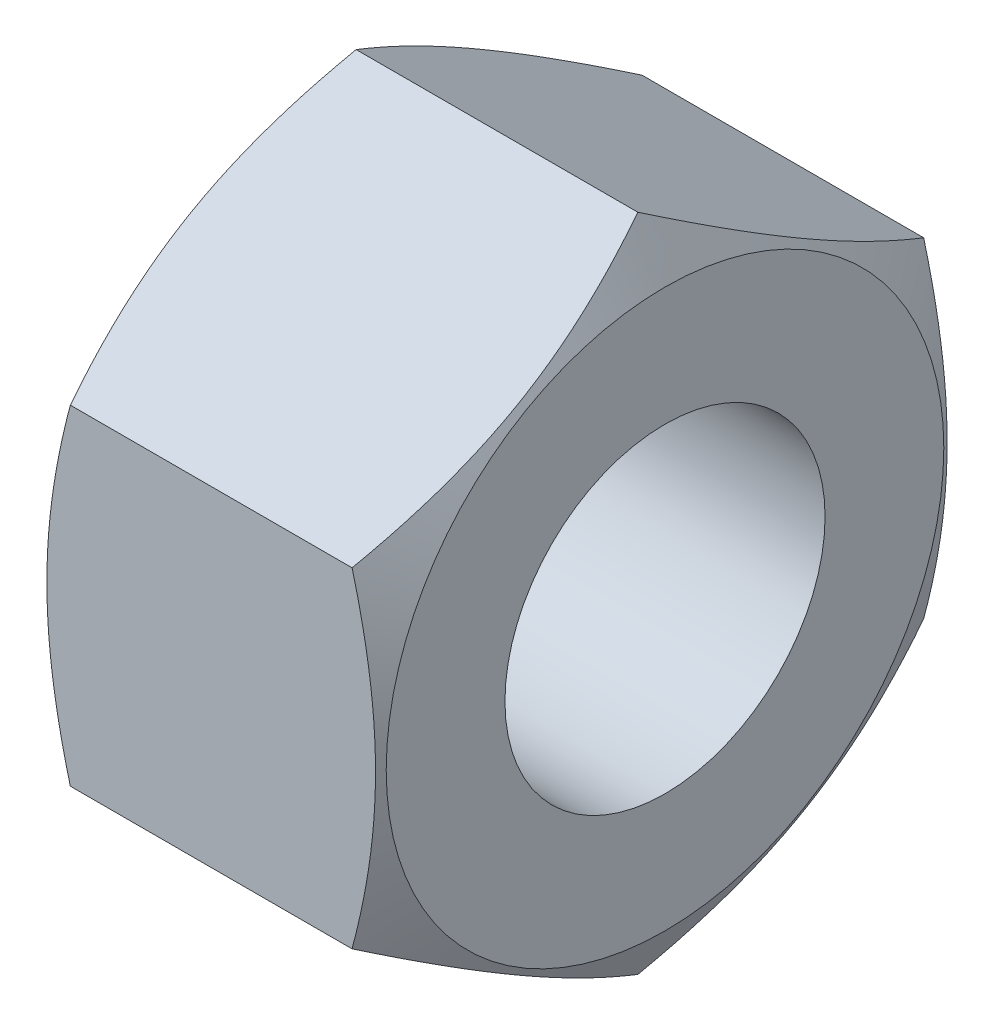
ISO-10303-21;
HEADER;
FILE_DESCRIPTION(('STEP AP214'),'2;1');
FILE_NAME('part.step','',(''),(''),'','','');
FILE_SCHEMA(('AUTOMOTIVE_DESIGN { 1 0 10303 214 1 1 1 1 }'));
ENDSEC;
DATA;
#1=APPLICATION_CONTEXT('core data for automotive mechanical design processes');
#2=APPLICATION_PROTOCOL_DEFINITION('international standard','automotive_design',2000,#1);
#3=PRODUCT_CONTEXT('',#1,'mechanical');
#4=PRODUCT('Part','Part','',(#3));
#5=PRODUCT_RELATED_PRODUCT_CATEGORY('part','',(#4));
#6=PRODUCT_DEFINITION_FORMATION('','',#4);
#7=PRODUCT_DEFINITION_CONTEXT('part definition',#1,'design');
#8=PRODUCT_DEFINITION('design','',#6,#7);
#9=PRODUCT_DEFINITION_SHAPE('','',#8);
#10=(LENGTH_UNIT() NAMED_UNIT(*) SI_UNIT(.MILLI.,.METRE.));
#11=(NAMED_UNIT(*) PLANE_ANGLE_UNIT() SI_UNIT($,.RADIAN.));
#12=(NAMED_UNIT(*) SI_UNIT($,.STERADIAN.) SOLID_ANGLE_UNIT());
#13=UNCERTAINTY_MEASURE_WITH_UNIT(LENGTH_MEASURE(1.E-05),#10,'distance_accuracy_value','');
#14=(GEOMETRIC_REPRESENTATION_CONTEXT(3) GLOBAL_UNCERTAINTY_ASSIGNED_CONTEXT((#13)) GLOBAL_UNIT_ASSIGNED_CONTEXT((#10,
#11,#12)) REPRESENTATION_CONTEXT('',''));
#15=CARTESIAN_POINT('',(0.,0.,0.));
#16=DIRECTION('',(0.,0.,1.));
#17=DIRECTION('',(1.,0.,0.));
#18=AXIS2_PLACEMENT_3D('',#15,#16,#17);
#19=CARTESIAN_POINT('',(4.1656,4.0914504176392,-7.0866));
#20=DIRECTION('',(0.,-0.866025403784439,0.5));
#21=DIRECTION('',(0.,-0.5,-0.866025403784439));
#22=AXIS2_PLACEMENT_3D('',#19,#20,#21);
#23=PLANE('',#22);
#24=DIRECTION('',(-1.,0.,0.));
#25=VECTOR('',#24,1.);
#26=CARTESIAN_POINT('',(4.1656,4.0914504176392,-7.0866));
#27=LINE('',#26,#25);
#28=CARTESIAN_POINT('',(3.49291061007736,4.09145041763921,-7.0866));
#29=VERTEX_POINT('',#28);
#30=CARTESIAN_POINT('',(-3.49291061007737,4.0914504176392,-7.0866));
#31=VERTEX_POINT('',#30);
#32=EDGE_CURVE('E118',#29,#31,#27,.T.);
#33=ORIENTED_EDGE('',*,*,#32,.T.);
#34=CARTESIAN_POINT('',(-3.49284944698746,4.09133494758537,-7.0868));
#35=CARTESIAN_POINT('',(-3.54013592969712,4.1806201534766,-6.93215348703214));
#36=CARTESIAN_POINT('',(-3.58526387533373,4.2701872542963,-6.77701871772578));
#37=CARTESIAN_POINT('',(-3.67063587417591,4.44993286243088,-6.46569019199931));
#38=CARTESIAN_POINT('',(-3.71087823275817,4.54011157050205,-6.30949608785912));
#39=CARTESIAN_POINT('',(-3.82350528792309,4.81184839157855,-5.83883410746738));
#40=CARTESIAN_POINT('',(-3.88762666610634,4.99430645597668,-5.52280746967914));
#41=CARTESIAN_POINT('',(-3.96326890457504,5.26745543006076,-5.0496995685302));
#42=CARTESIAN_POINT('',(-3.98493435723433,5.3574629975987,-4.89380188848879));
#43=CARTESIAN_POINT('',(-4.02142922279015,5.53782338463285,-4.58140853447285));
#44=CARTESIAN_POINT('',(-4.03625913133281,5.62817617861748,-4.42491290468567));
#45=CARTESIAN_POINT('',(-4.05873169011805,5.80902364400902,-4.11167590620747));
#46=CARTESIAN_POINT('',(-4.06638089663388,5.89951811028071,-3.95493489282109));
#47=CARTESIAN_POINT('',(-4.07434155678021,6.08058259164757,-3.64132201164757));
#48=CARTESIAN_POINT('',(-4.07465318235712,6.17115260492267,-3.4844501470129));
#49=CARTESIAN_POINT('',(-4.06528776525616,6.42242679222706,-3.04923048797112));
#50=CARTESIAN_POINT('',(-4.04768026282338,6.58307242484238,-2.77098409026735));
#51=CARTESIAN_POINT('',(-3.99047362355076,6.90347354772477,-2.21603306663293));
#52=CARTESIAN_POINT('',(-3.95085756597656,7.06322825745894,-1.93932979262492));
#53=CARTESIAN_POINT('',(-3.85130371945199,7.38420380751608,-1.38338383193859));
#54=CARTESIAN_POINT('',(-3.79099589862718,7.54539526684749,-1.10419203463041));
#55=CARTESIAN_POINT('',(-3.65364471299299,7.86572449177811,-0.549365541901417));
#56=CARTESIAN_POINT('',(-3.57662881892472,8.02486517947751,-0.273725785254608));
#57=CARTESIAN_POINT('',(-3.49284944698746,8.18301630533225,0.000200000000012393));
#58=B_SPLINE_CURVE_WITH_KNOTS('',3,(#34,#35,#36,#37,#38,#39,#40,#41,#42,#43,#44,#45,#46,#47,#48,
#49,#50,#51,#52,#53,#54,#55,#56,#57),.UNSPECIFIED.,.F.,.F.,(4,2,2,2,2,2,2,2,2,2,2,4),(0.,
0.554138489511831,1.10846864261952,2.21899620872019,2.76283413836877,3.30663262805729,
3.8499341232908,4.39322288696728,5.35766792749024,6.3228554859864,7.30629033999155,
8.28812036143337),.UNSPECIFIED.);
#59=CARTESIAN_POINT('',(-3.49291061007736,8.18290083527841,0.));
#60=VERTEX_POINT('',#59);
#61=EDGE_CURVE('E53',#31,#60,#58,.T.);
#62=ORIENTED_EDGE('',*,*,#61,.T.);
#63=DIRECTION('',(-1.,0.,0.));
#64=VECTOR('',#63,1.);
#65=CARTESIAN_POINT('',(4.1656,8.18290083527841,0.));
#66=LINE('',#65,#64);
#67=CARTESIAN_POINT('',(3.49291061007736,8.18290083527841,0.));
#68=VERTEX_POINT('',#67);
#69=EDGE_CURVE('E11',#68,#60,#66,.T.);
#70=ORIENTED_EDGE('',*,*,#69,.F.);
#71=CARTESIAN_POINT('',(3.49284944698746,8.18301630533225,0.000200000000013293));
#72=CARTESIAN_POINT('',(3.54013592969712,8.09373109944102,-0.154446512967842));
#73=CARTESIAN_POINT('',(3.58526387533373,8.00416399862132,-0.309581282274208));
#74=CARTESIAN_POINT('',(3.67063587417591,7.82441839048673,-0.620909808000674));
#75=CARTESIAN_POINT('',(3.71087823275817,7.73423968241556,-0.777103912140869));
#76=CARTESIAN_POINT('',(3.82350528792309,7.46250286133907,-1.24776589253261));
#77=CARTESIAN_POINT('',(3.88762666610634,7.28004479694093,-1.56379253032085));
#78=CARTESIAN_POINT('',(3.96326890457504,7.00689582285685,-2.03690043146979));
#79=CARTESIAN_POINT('',(3.98493435723432,6.91688825531891,-2.19279811151119));
#80=CARTESIAN_POINT('',(4.02142922279014,6.73652786828476,-2.50519146552713));
#81=CARTESIAN_POINT('',(4.03625913133281,6.64617507430013,-2.66168709531431));
#82=CARTESIAN_POINT('',(4.05873169011804,6.46532760890859,-2.97492409379252));
#83=CARTESIAN_POINT('',(4.06638089663388,6.37483314263691,-3.1316651071789));
#84=CARTESIAN_POINT('',(4.07434155678021,6.19376866127004,-3.44527798835242));
#85=CARTESIAN_POINT('',(4.07465318235712,6.10319864799494,-3.60214985298708));
#86=CARTESIAN_POINT('',(4.06528776525616,5.85192446069055,-4.03736951202887));
#87=CARTESIAN_POINT('',(4.04768026282338,5.69127882807524,-4.31561590973263));
#88=CARTESIAN_POINT('',(3.99047362355076,5.37087770519284,-4.87056693336706));
#89=CARTESIAN_POINT('',(3.95085756597656,5.21112299545867,-5.14727020737506));
#90=CARTESIAN_POINT('',(3.85130371945199,4.89014744540153,-5.7032161680614));
#91=CARTESIAN_POINT('',(3.79099589862718,4.72895598607012,-5.98240796536958));
#92=CARTESIAN_POINT('',(3.65364471299299,4.4086267611395,-6.53723445809857));
#93=CARTESIAN_POINT('',(3.57662881892472,4.2494860734401,-6.81287421474538));
#94=CARTESIAN_POINT('',(3.49284944698746,4.09133494758537,-7.0868));
#95=B_SPLINE_CURVE_WITH_KNOTS('',3,(#71,#72,#73,#74,#75,#76,#77,#78,#79,#80,#81,#82,#83,#84,#85,
#86,#87,#88,#89,#90,#91,#92,#93,#94),.UNSPECIFIED.,.F.,.F.,(4,2,2,2,2,2,2,2,2,2,2,4),(0.,
0.554138489511831,1.10846864261952,2.21899620872019,2.76283413836877,3.3066326280573,
3.8499341232908,4.39322288696728,5.35766792749025,6.3228554859864,7.30629033999155,
8.28812036143337),.UNSPECIFIED.);
#96=EDGE_CURVE('E121',#68,#29,#95,.T.);
#97=ORIENTED_EDGE('',*,*,#96,.T.);
#98=EDGE_LOOP('',(#33,#62,#70,#97));
#99=FACE_BOUND('',#98,.T.);
#100=ADVANCED_FACE('F38',(#99),#23,.F.);
#101=CARTESIAN_POINT('',(4.1656,8.18290083527841,0.));
#102=DIRECTION('',(0.,-0.866025403784438,-0.5));
#103=DIRECTION('',(0.,0.5,-0.866025403784438));
#104=AXIS2_PLACEMENT_3D('',#101,#102,#103);
#105=PLANE('',#104);
#106=ORIENTED_EDGE('',*,*,#69,.T.);
#107=CARTESIAN_POINT('',(-3.49284944698746,8.18301630533225,-0.000199999999986746));
#108=CARTESIAN_POINT('',(-3.54013592969712,8.09373109944102,0.154446512967869));
#109=CARTESIAN_POINT('',(-3.58526387533373,8.00416399862132,0.309581282274235));
#110=CARTESIAN_POINT('',(-3.67063587417591,7.82441839048673,0.6209098080007));
#111=CARTESIAN_POINT('',(-3.71087823275817,7.73423968241556,0.777103912140895));
#112=CARTESIAN_POINT('',(-3.82350528792309,7.46250286133907,1.24776589253263));
#113=CARTESIAN_POINT('',(-3.88762666610634,7.28004479694093,1.56379253032087));
#114=CARTESIAN_POINT('',(-3.96326890457503,7.00689582285685,2.03690043146982));
#115=CARTESIAN_POINT('',(-3.98493435723432,6.91688825531891,2.19279811151122));
#116=CARTESIAN_POINT('',(-4.02142922279014,6.73652786828476,2.50519146552716));
#117=CARTESIAN_POINT('',(-4.03625913133281,6.64617507430013,2.66168709531434));
#118=CARTESIAN_POINT('',(-4.05873169011804,6.46532760890859,2.97492409379254));
#119=CARTESIAN_POINT('',(-4.06638089663387,6.3748331426369,3.13166510717893));
#120=CARTESIAN_POINT('',(-4.07434155678021,6.19376866127004,3.44527798835245));
#121=CARTESIAN_POINT('',(-4.07465318235711,6.10319864799494,3.60214985298711));
#122=CARTESIAN_POINT('',(-4.06528776525615,5.85192446069055,4.03736951202889));
#123=CARTESIAN_POINT('',(-4.04768026282338,5.69127882807523,4.31561590973266));
#124=CARTESIAN_POINT('',(-3.99047362355075,5.37087770519284,4.87056693336707));
#125=CARTESIAN_POINT('',(-3.95085756597656,5.21112299545867,5.14727020737508));
#126=CARTESIAN_POINT('',(-3.85130371945199,4.89014744540153,5.70321616806141));
#127=CARTESIAN_POINT('',(-3.79099589862717,4.72895598607012,5.98240796536959));
#128=CARTESIAN_POINT('',(-3.65364471299299,4.4086267611395,6.53723445809858));
#129=CARTESIAN_POINT('',(-3.57662881892472,4.2494860734401,6.81287421474538));
#130=CARTESIAN_POINT('',(-3.49284944698746,4.09133494758537,7.0868));
#131=B_SPLINE_CURVE_WITH_KNOTS('',3,(#107,#108,#109,#110,#111,#112,#113,#114,#115,#116,#117,
#118,#119,#120,#121,#122,#123,#124,#125,#126,#127,#128,#129,#130),.UNSPECIFIED.,.F.,.F.,(4,2,2,
2,2,2,2,2,2,2,2,4),(0.,0.55413848951183,1.10846864261952,2.21899620872019,2.76283413836877,
3.3066326280573,3.8499341232908,4.39322288696728,5.35766792749024,6.32285548598639,
7.30629033999154,8.28812036143335),.UNSPECIFIED.);
#132=CARTESIAN_POINT('',(-3.49291061007736,4.0914504176392,7.08660000000001));
#133=VERTEX_POINT('',#132);
#134=EDGE_CURVE('E92',#60,#133,#131,.T.);
#135=ORIENTED_EDGE('',*,*,#134,.T.);
#136=DIRECTION('',(-1.,0.,0.));
#137=VECTOR('',#136,1.);
#138=CARTESIAN_POINT('',(4.1656,4.09145041763921,7.08660000000001));
#139=LINE('',#138,#137);
#140=CARTESIAN_POINT('',(3.49291061007736,4.0914504176392,7.08660000000001));
#141=VERTEX_POINT('',#140);
#142=EDGE_CURVE('E46',#141,#133,#139,.T.);
#143=ORIENTED_EDGE('',*,*,#142,.F.);
#144=CARTESIAN_POINT('',(3.49284944698746,4.09133494758537,7.0868));
#145=CARTESIAN_POINT('',(3.54013592969712,4.1806201534766,6.93215348703215));
#146=CARTESIAN_POINT('',(3.58526387533373,4.2701872542963,6.77701871772578));
#147=CARTESIAN_POINT('',(3.67063587417591,4.44993286243088,6.46569019199932));
#148=CARTESIAN_POINT('',(3.71087823275817,4.54011157050206,6.30949608785912));
#149=CARTESIAN_POINT('',(3.82350528792309,4.81184839157855,5.83883410746738));
#150=CARTESIAN_POINT('',(3.88762666610634,4.99430645597668,5.52280746967914));
#151=CARTESIAN_POINT('',(3.96326890457503,5.26745543006077,5.0496995685302));
#152=CARTESIAN_POINT('',(3.98493435723432,5.35746299759871,4.8938018884888));
#153=CARTESIAN_POINT('',(4.02142922279014,5.53782338463286,4.58140853447286));
#154=CARTESIAN_POINT('',(4.03625913133281,5.62817617861749,4.42491290468568));
#155=CARTESIAN_POINT('',(4.05873169011804,5.80902364400903,4.11167590620747));
#156=CARTESIAN_POINT('',(4.06638089663387,5.89951811028071,3.95493489282109));
#157=CARTESIAN_POINT('',(4.07434155678021,6.08058259164758,3.64132201164757));
#158=CARTESIAN_POINT('',(4.07465318235711,6.17115260492268,3.48445014701291));
#159=CARTESIAN_POINT('',(4.06528776525615,6.42242679222707,3.04923048797113));
#160=CARTESIAN_POINT('',(4.04768026282338,6.58307242484238,2.77098409026736));
#161=CARTESIAN_POINT('',(3.99047362355075,6.90347354772478,2.21603306663294));
#162=CARTESIAN_POINT('',(3.95085756597656,7.06322825745895,1.93932979262494));
#163=CARTESIAN_POINT('',(3.85130371945199,7.38420380751608,1.38338383193861));
#164=CARTESIAN_POINT('',(3.79099589862717,7.5453952668475,1.10419203463043));
#165=CARTESIAN_POINT('',(3.65364471299299,7.86572449177812,0.54936554190144));
#166=CARTESIAN_POINT('',(3.57662881892472,8.02486517947751,0.273725785254634));
#167=CARTESIAN_POINT('',(3.49284944698746,8.18301630533225,-0.000199999999986431));
#168=B_SPLINE_CURVE_WITH_KNOTS('',3,(#144,#145,#146,#147,#148,#149,#150,#151,#152,#153,#154,
#155,#156,#157,#158,#159,#160,#161,#162,#163,#164,#165,#166,#167),.UNSPECIFIED.,.F.,.F.,(4,2,2,
2,2,2,2,2,2,2,2,4),(0.,0.554138489511831,1.10846864261952,2.21899620872019,2.76283413836878,
3.3066326280573,3.8499341232908,4.39322288696728,5.35766792749024,6.32285548598639,
7.30629033999154,8.28812036143335),.UNSPECIFIED.);
#169=EDGE_CURVE('E129',#141,#68,#168,.T.);
#170=ORIENTED_EDGE('',*,*,#169,.T.);
#171=EDGE_LOOP('',(#106,#135,#143,#170));
#172=FACE_BOUND('',#171,.T.);
#173=ADVANCED_FACE('F102',(#172),#105,.F.);
#174=CARTESIAN_POINT('',(4.1656,4.09145041763921,7.08660000000001));
#175=DIRECTION('',(0.,0.,-1.));
#176=DIRECTION('',(-1.,0.,0.));
#177=AXIS2_PLACEMENT_3D('',#174,#175,#176);
#178=PLANE('',#177);
#179=ORIENTED_EDGE('',*,*,#142,.T.);
#180=CARTESIAN_POINT('',(-0.968100698834352,-10.8384622995141,7.08660000000001));
#181=CARTESIAN_POINT('',(-1.10687410230509,-10.5253436418365,7.08660000000001));
#182=CARTESIAN_POINT('',(-1.24421036318027,-10.2115762785763,7.08660000000001));
#183=CARTESIAN_POINT('',(-1.51519404807197,-9.58239760983985,7.08660000000001));
#184=CARTESIAN_POINT('',(-1.64884090430086,-9.26698606011039,7.08660000000001));
#185=CARTESIAN_POINT('',(-1.91223344632852,-8.63271443431317,7.08660000000001));
#186=CARTESIAN_POINT('',(-2.04195674893995,-8.31384502951903,7.08660000000001));
#187=CARTESIAN_POINT('',(-2.29563246992184,-7.67382730845305,7.08660000000001));
#188=CARTESIAN_POINT('',(-2.41958515164579,-7.35267909695134,7.08660000000001));
#189=CARTESIAN_POINT('',(-2.6612062718133,-6.70496940823909,7.08660000000001));
#190=CARTESIAN_POINT('',(-2.77881390038117,-6.37838512378175,7.08660000000001));
#191=CARTESIAN_POINT('',(-3.00458879254002,-5.72191225175333,7.08660000000001));
#192=CARTESIAN_POINT('',(-3.11275519405564,-5.39202336549955,7.08660000000001));
#193=CARTESIAN_POINT('',(-3.31680323538464,-4.72910677286058,7.08660000000001));
#194=CARTESIAN_POINT('',(-3.41270746967714,-4.39608608973912,7.08660000000001));
#195=CARTESIAN_POINT('',(-3.5891647354466,-3.72603843228916,7.08660000000001));
#196=CARTESIAN_POINT('',(-3.66972181124715,-3.38901253836441,7.08660000000001));
#197=CARTESIAN_POINT('',(-3.8117343373438,-2.71078095143706,7.08660000000001));
#198=CARTESIAN_POINT('',(-3.87318346222682,-2.36957391309578,7.08660000000001));
#199=CARTESIAN_POINT('',(-3.97305405425339,-1.68367130211007,7.08660000000001));
#200=CARTESIAN_POINT('',(-4.0114742928457,-1.33897554434586,7.08660000000001));
#201=CARTESIAN_POINT('',(-4.04955000419659,-0.821364483144449,7.08660000000001));
#202=CARTESIAN_POINT('',(-4.05898338904507,-0.649132058385395,7.08660000000001));
#203=CARTESIAN_POINT('',(-4.07123650360052,-0.304424690759988,7.08660000000001));
#204=CARTESIAN_POINT('',(-4.07405626935816,-0.131949749220716,7.08660000000001));
#205=CARTESIAN_POINT('',(-4.07301241052808,0.212925861470585,7.08660000000001));
#206=CARTESIAN_POINT('',(-4.06915084772161,0.385326537119742,7.08660000000001));
#207=CARTESIAN_POINT('',(-4.05483802841007,0.729852553890439,7.08660000000001));
#208=CARTESIAN_POINT('',(-4.04438661113482,0.901977888191868,7.08660000000001));
#209=CARTESIAN_POINT('',(-4.00891532169957,1.34888000252969,7.08660000000001));
#210=CARTESIAN_POINT('',(-3.9789166829343,1.62327207014505,7.08660000000001));
#211=CARTESIAN_POINT('',(-3.90404712469849,2.17005791106688,7.08660000000001));
#212=CARTESIAN_POINT('',(-3.85917175568929,2.44245106156505,7.08660000000001));
#213=CARTESIAN_POINT('',(-3.75640015266674,2.98504470870769,7.08660000000001));
#214=CARTESIAN_POINT('',(-3.69849004374906,3.25524254864737,7.08660000000001));
#215=CARTESIAN_POINT('',(-3.57166401277696,3.79298791600285,7.08660000000001));
#216=CARTESIAN_POINT('',(-3.50274913648101,4.06053569268514,7.08660000000001));
#217=CARTESIAN_POINT('',(-3.35407185165277,4.59918915883832,7.08660000000001));
#218=CARTESIAN_POINT('',(-3.27409692464247,4.87023573717299,7.08660000000001));
#219=CARTESIAN_POINT('',(-3.10633672272325,5.40966524322582,7.08660000000001));
#220=CARTESIAN_POINT('',(-3.01855726725898,5.67804999247681,7.08660000000001));
#221=CARTESIAN_POINT('',(-2.83713251872851,6.21098657398704,7.08660000000001));
#222=CARTESIAN_POINT('',(-2.7435263401787,6.47555180578406,7.08660000000001));
#223=CARTESIAN_POINT('',(-2.55101902445884,7.00289277658729,7.08660000000001));
#224=CARTESIAN_POINT('',(-2.45211543527442,7.26566762232551,7.08660000000001));
#225=CARTESIAN_POINT('',(-2.35113189758459,7.52761573197558,7.08660000000001));
#226=B_SPLINE_CURVE_WITH_KNOTS('',3,(#180,#181,#182,#183,#184,#185,#186,#187,#188,#189,#190,
#191,#192,#193,#194,#195,#196,#197,#198,#199,#200,#201,#202,#203,#204,#205,#206,#207,#208,#209,
#210,#211,#212,#213,#214,#215,#216,#217,#218,#219,#220,#221,#222,#223,#224,#225),.UNSPECIFIED.,
.F.,.F.,(4,2,2,2,2,2,2,2,2,2,2,2,2,2,2,2,2,2,2,2,2,2,4),(0.,1.02749101453612,2.05513928495921,
3.08783458340175,4.12048270649621,5.1617156159433,6.20304350078552,7.24242408304071,
8.28153038497137,9.32098030284398,10.3604856686368,10.877849647059,11.3952108053369,
11.9124123403772,12.4296264938768,13.2572211987724,14.0850636558227,14.9137915172189,
15.7424406732706,16.5900927989127,17.4371180903779,18.2789683921399,19.1212117867742),.UNSPECIFIED.);
#227=CARTESIAN_POINT('',(-3.49291061007736,-4.0914504176392,7.0866));
#228=VERTEX_POINT('',#227);
#229=EDGE_CURVE('E89',#133,#228,#226,.F.);
#230=ORIENTED_EDGE('',*,*,#229,.T.);
#231=DIRECTION('',(-1.,0.,0.));
#232=VECTOR('',#231,1.);
#233=CARTESIAN_POINT('',(4.1656,-4.0914504176392,7.08660000000001));
#234=LINE('',#233,#232);
#235=CARTESIAN_POINT('',(3.49291061007736,-4.0914504176392,7.0866));
#236=VERTEX_POINT('',#235);
#237=EDGE_CURVE('E109',#236,#228,#234,.T.);
#238=ORIENTED_EDGE('',*,*,#237,.F.);
#239=CARTESIAN_POINT('',(0.968100698834352,-10.8384622995141,7.08660000000001));
#240=CARTESIAN_POINT('',(1.10687410230509,-10.5253436418365,7.08660000000001));
#241=CARTESIAN_POINT('',(1.24421036318027,-10.2115762785763,7.08660000000001));
#242=CARTESIAN_POINT('',(1.51519404807197,-9.58239760983985,7.08660000000001));
#243=CARTESIAN_POINT('',(1.64884090430086,-9.26698606011039,7.08660000000001));
#244=CARTESIAN_POINT('',(1.91223344632852,-8.63271443431317,7.08660000000001));
#245=CARTESIAN_POINT('',(2.04195674893995,-8.31384502951903,7.08660000000001));
#246=CARTESIAN_POINT('',(2.29563246992184,-7.67382730845305,7.08660000000001));
#247=CARTESIAN_POINT('',(2.41958515164579,-7.35267909695134,7.08660000000001));
#248=CARTESIAN_POINT('',(2.6612062718133,-6.70496940823909,7.08660000000001));
#249=CARTESIAN_POINT('',(2.77881390038117,-6.37838512378175,7.08660000000001));
#250=CARTESIAN_POINT('',(3.00458879254002,-5.72191225175333,7.08660000000001));
#251=CARTESIAN_POINT('',(3.11275519405564,-5.39202336549955,7.08660000000001));
#252=CARTESIAN_POINT('',(3.31680323538464,-4.72910677286058,7.08660000000001));
#253=CARTESIAN_POINT('',(3.41270746967714,-4.39608608973912,7.08660000000001));
#254=CARTESIAN_POINT('',(3.5891647354466,-3.72603843228916,7.08660000000001));
#255=CARTESIAN_POINT('',(3.66972181124715,-3.38901253836441,7.08660000000001));
#256=CARTESIAN_POINT('',(3.8117343373438,-2.71078095143706,7.08660000000001));
#257=CARTESIAN_POINT('',(3.87318346222682,-2.36957391309578,7.08660000000001));
#258=CARTESIAN_POINT('',(3.97305405425339,-1.68367130211007,7.08660000000001));
#259=CARTESIAN_POINT('',(4.0114742928457,-1.33897554434586,7.08660000000001));
#260=CARTESIAN_POINT('',(4.04955000419659,-0.821364483144449,7.08660000000001));
#261=CARTESIAN_POINT('',(4.05898338904507,-0.649132058385395,7.08660000000001));
#262=CARTESIAN_POINT('',(4.07123650360052,-0.304424690759988,7.08660000000001));
#263=CARTESIAN_POINT('',(4.07405626935816,-0.131949749220716,7.08660000000001));
#264=CARTESIAN_POINT('',(4.07301241052808,0.212925861470585,7.08660000000001));
#265=CARTESIAN_POINT('',(4.06915084772161,0.385326537119742,7.08660000000001));
#266=CARTESIAN_POINT('',(4.05483802841007,0.729852553890439,7.08660000000001));
#267=CARTESIAN_POINT('',(4.04438661113482,0.901977888191868,7.08660000000001));
#268=CARTESIAN_POINT('',(4.00891532169957,1.34888000252969,7.08660000000001));
#269=CARTESIAN_POINT('',(3.9789166829343,1.62327207014505,7.08660000000001));
#270=CARTESIAN_POINT('',(3.90404712469849,2.17005791106688,7.08660000000001));
#271=CARTESIAN_POINT('',(3.85917175568929,2.44245106156505,7.08660000000001));
#272=CARTESIAN_POINT('',(3.75640015266674,2.98504470870769,7.08660000000001));
#273=CARTESIAN_POINT('',(3.69849004374906,3.25524254864737,7.08660000000001));
#274=CARTESIAN_POINT('',(3.57166401277696,3.79298791600285,7.08660000000001));
#275=CARTESIAN_POINT('',(3.50274913648101,4.06053569268514,7.08660000000001));
#276=CARTESIAN_POINT('',(3.35407185165277,4.59918915883832,7.08660000000001));
#277=CARTESIAN_POINT('',(3.27409692464247,4.87023573717299,7.08660000000001));
#278=CARTESIAN_POINT('',(3.10633672272325,5.40966524322582,7.08660000000001));
#279=CARTESIAN_POINT('',(3.01855726725898,5.67804999247681,7.08660000000001));
#280=CARTESIAN_POINT('',(2.83713251872851,6.21098657398704,7.08660000000001));
#281=CARTESIAN_POINT('',(2.7435263401787,6.47555180578406,7.08660000000001));
#282=CARTESIAN_POINT('',(2.55101902445884,7.00289277658729,7.08660000000001));
#283=CARTESIAN_POINT('',(2.45211543527442,7.26566762232551,7.08660000000001));
#284=CARTESIAN_POINT('',(2.35113189758459,7.52761573197558,7.08660000000001));
#285=B_SPLINE_CURVE_WITH_KNOTS('',3,(#239,#240,#241,#242,#243,#244,#245,#246,#247,#248,#249,
#250,#251,#252,#253,#254,#255,#256,#257,#258,#259,#260,#261,#262,#263,#264,#265,#266,#267,#268,
#269,#270,#271,#272,#273,#274,#275,#276,#277,#278,#279,#280,#281,#282,#283,#284),.UNSPECIFIED.,
.F.,.F.,(4,2,2,2,2,2,2,2,2,2,2,2,2,2,2,2,2,2,2,2,2,2,4),(0.,1.02749101453612,2.05513928495921,
3.08783458340175,4.12048270649621,5.1617156159433,6.20304350078552,7.24242408304071,
8.28153038497137,9.32098030284398,10.3604856686368,10.877849647059,11.3952108053369,
11.9124123403772,12.4296264938768,13.2572211987724,14.0850636558227,14.9137915172189,
15.7424406732706,16.5900927989127,17.4371180903779,18.2789683921399,19.1212117867742),.UNSPECIFIED.);
#286=EDGE_CURVE('E108',#236,#141,#285,.T.);
#287=ORIENTED_EDGE('',*,*,#286,.T.);
#288=EDGE_LOOP('',(#179,#230,#238,#287));
#289=FACE_BOUND('',#288,.T.);
#290=ADVANCED_FACE('F107',(#289),#178,.F.);
#291=CARTESIAN_POINT('',(4.1656,-4.0914504176392,7.08660000000001));
#292=DIRECTION('',(0.,0.866025403784439,-0.499999999999999));
#293=DIRECTION('',(0.,0.5,0.866025403784439));
#294=AXIS2_PLACEMENT_3D('',#291,#292,#293);
#295=PLANE('',#294);
#296=ORIENTED_EDGE('',*,*,#237,.T.);
#297=CARTESIAN_POINT('',(-3.49284944698746,-4.09133494758537,7.0868));
#298=CARTESIAN_POINT('',(-3.54013592969712,-4.1806201534766,6.93215348703215));
#299=CARTESIAN_POINT('',(-3.58526387533373,-4.2701872542963,6.77701871772578));
#300=CARTESIAN_POINT('',(-3.67063587417591,-4.44993286243088,6.46569019199932));
#301=CARTESIAN_POINT('',(-3.71087823275817,-4.54011157050205,6.30949608785912));
#302=CARTESIAN_POINT('',(-3.82350528792309,-4.81184839157855,5.83883410746738));
#303=CARTESIAN_POINT('',(-3.88762666610634,-4.99430645597668,5.52280746967914));
#304=CARTESIAN_POINT('',(-3.96326890457504,-5.26745543006076,5.0496995685302));
#305=CARTESIAN_POINT('',(-3.98493435723432,-5.3574629975987,4.8938018884888));
#306=CARTESIAN_POINT('',(-4.02142922279014,-5.53782338463285,4.58140853447286));
#307=CARTESIAN_POINT('',(-4.03625913133281,-5.62817617861748,4.42491290468568));
#308=CARTESIAN_POINT('',(-4.05873169011804,-5.80902364400902,4.11167590620747));
#309=CARTESIAN_POINT('',(-4.06638089663388,-5.89951811028071,3.95493489282109));
#310=CARTESIAN_POINT('',(-4.07434155678021,-6.08058259164757,3.64132201164757));
#311=CARTESIAN_POINT('',(-4.07465318235711,-6.17115260492267,3.48445014701291));
#312=CARTESIAN_POINT('',(-4.06528776525616,-6.42242679222706,3.04923048797113));
#313=CARTESIAN_POINT('',(-4.04768026282338,-6.58307242484238,2.77098409026736));
#314=CARTESIAN_POINT('',(-3.99047362355076,-6.90347354772477,2.21603306663294));
#315=CARTESIAN_POINT('',(-3.95085756597656,-7.06322825745894,1.93932979262493));
#316=CARTESIAN_POINT('',(-3.85130371945199,-7.38420380751608,1.3833838319386));
#317=CARTESIAN_POINT('',(-3.79099589862718,-7.54539526684749,1.10419203463042));
#318=CARTESIAN_POINT('',(-3.65364471299299,-7.86572449177811,0.549365541901431));
#319=CARTESIAN_POINT('',(-3.57662881892472,-8.02486517947751,0.273725785254624));
#320=CARTESIAN_POINT('',(-3.49284944698746,-8.18301630533224,-0.000199999999997568));
#321=B_SPLINE_CURVE_WITH_KNOTS('',3,(#297,#298,#299,#300,#301,#302,#303,#304,#305,#306,#307,
#308,#309,#310,#311,#312,#313,#314,#315,#316,#317,#318,#319,#320),.UNSPECIFIED.,.F.,.F.,(4,2,2,
2,2,2,2,2,2,2,2,4),(0.,0.554138489511832,1.10846864261953,2.21899620872019,2.76283413836877,
3.3066326280573,3.8499341232908,4.39322288696728,5.35766792749024,6.32285548598639,
7.30629033999154,8.28812036143336),.UNSPECIFIED.);
#322=CARTESIAN_POINT('',(-3.49291061007736,-8.18290083527841,0.));
#323=VERTEX_POINT('',#322);
#324=EDGE_CURVE('E94',#228,#323,#321,.T.);
#325=ORIENTED_EDGE('',*,*,#324,.T.);
#326=DIRECTION('',(-1.,0.,0.));
#327=VECTOR('',#326,1.);
#328=CARTESIAN_POINT('',(4.1656,-8.1829008352784,0.));
#329=LINE('',#328,#327);
#330=CARTESIAN_POINT('',(3.49291061007736,-8.18290083527841,0.));
#331=VERTEX_POINT('',#330);
#332=EDGE_CURVE('E110',#331,#323,#329,.T.);
#333=ORIENTED_EDGE('',*,*,#332,.F.);
#334=CARTESIAN_POINT('',(3.49284944698746,-8.18301630533224,-0.000199999999997769));
#335=CARTESIAN_POINT('',(3.54013592969712,-8.09373109944101,0.154446512967858));
#336=CARTESIAN_POINT('',(3.58526387533373,-8.00416399862131,0.309581282274224));
#337=CARTESIAN_POINT('',(3.67063587417591,-7.82441839048673,0.62090980800069));
#338=CARTESIAN_POINT('',(3.71087823275817,-7.73423968241555,0.777103912140885));
#339=CARTESIAN_POINT('',(3.82350528792309,-7.46250286133906,1.24776589253262));
#340=CARTESIAN_POINT('',(3.88762666610634,-7.28004479694093,1.56379253032086));
#341=CARTESIAN_POINT('',(3.96326890457504,-7.00689582285685,2.0369004314698));
#342=CARTESIAN_POINT('',(3.98493435723433,-6.91688825531891,2.19279811151121));
#343=CARTESIAN_POINT('',(4.02142922279015,-6.73652786828475,2.50519146552715));
#344=CARTESIAN_POINT('',(4.03625913133281,-6.64617507430013,2.66168709531433));
#345=CARTESIAN_POINT('',(4.05873169011804,-6.46532760890859,2.97492409379253));
#346=CARTESIAN_POINT('',(4.06638089663388,-6.3748331426369,3.13166510717892));
#347=CARTESIAN_POINT('',(4.07434155678021,-6.19376866127004,3.44527798835244));
#348=CARTESIAN_POINT('',(4.07465318235711,-6.10319864799493,3.6021498529871));
#349=CARTESIAN_POINT('',(4.06528776525616,-5.85192446069055,4.03736951202888));
#350=CARTESIAN_POINT('',(4.04768026282338,-5.69127882807523,4.31561590973265));
#351=CARTESIAN_POINT('',(3.99047362355076,-5.37087770519284,4.87056693336707));
#352=CARTESIAN_POINT('',(3.95085756597656,-5.21112299545867,5.14727020737507));
#353=CARTESIAN_POINT('',(3.85130371945199,-4.89014744540153,5.70321616806141));
#354=CARTESIAN_POINT('',(3.79099589862718,-4.72895598607012,5.98240796536959));
#355=CARTESIAN_POINT('',(3.65364471299299,-4.4086267611395,6.53723445809858));
#356=CARTESIAN_POINT('',(3.57662881892472,-4.2494860734401,6.81287421474539));
#357=CARTESIAN_POINT('',(3.49284944698746,-4.09133494758537,7.08680000000001));
#358=B_SPLINE_CURVE_WITH_KNOTS('',3,(#334,#335,#336,#337,#338,#339,#340,#341,#342,#343,#344,
#345,#346,#347,#348,#349,#350,#351,#352,#353,#354,#355,#356,#357),.UNSPECIFIED.,.F.,.F.,(4,2,2,
2,2,2,2,2,2,2,2,4),(0.,0.554138489511831,1.10846864261952,2.21899620872019,2.76283413836877,
3.30663262805729,3.8499341232908,4.39322288696728,5.35766792749024,6.32285548598639,
7.30629033999154,8.28812036143336),.UNSPECIFIED.);
#359=EDGE_CURVE('E166',#331,#236,#358,.T.);
#360=ORIENTED_EDGE('',*,*,#359,.T.);
#361=EDGE_LOOP('',(#296,#325,#333,#360));
#362=FACE_BOUND('',#361,.T.);
#363=ADVANCED_FACE('F179',(#362),#295,.F.);
#364=CARTESIAN_POINT('',(4.1656,-8.1829008352784,0.));
#365=DIRECTION('',(0.,0.866025403784439,0.499999999999999));
#366=DIRECTION('',(0.,-0.499999999999999,0.866025403784439));
#367=AXIS2_PLACEMENT_3D('',#364,#365,#366);
#368=PLANE('',#367);
#369=ORIENTED_EDGE('',*,*,#332,.T.);
#370=CARTESIAN_POINT('',(-3.49284944698746,-8.18301630533224,0.000200000000002218));
#371=CARTESIAN_POINT('',(-3.54013592969712,-8.09373109944101,-0.154446512967853));
#372=CARTESIAN_POINT('',(-3.58526387533373,-8.00416399862131,-0.309581282274219));
#373=CARTESIAN_POINT('',(-3.67063587417591,-7.82441839048673,-0.620909808000686));
#374=CARTESIAN_POINT('',(-3.71087823275817,-7.73423968241555,-0.77710391214088));
#375=CARTESIAN_POINT('',(-3.82350528792309,-7.46250286133906,-1.24776589253262));
#376=CARTESIAN_POINT('',(-3.88762666610634,-7.28004479694093,-1.56379253032086));
#377=CARTESIAN_POINT('',(-3.96326890457504,-7.00689582285685,-2.0369004314698));
#378=CARTESIAN_POINT('',(-3.98493435723433,-6.91688825531891,-2.1927981115112));
#379=CARTESIAN_POINT('',(-4.02142922279014,-6.73652786828475,-2.50519146552715));
#380=CARTESIAN_POINT('',(-4.03625913133281,-6.64617507430013,-2.66168709531432));
#381=CARTESIAN_POINT('',(-4.05873169011804,-6.46532760890859,-2.97492409379253));
#382=CARTESIAN_POINT('',(-4.06638089663388,-6.3748331426369,-3.13166510717891));
#383=CARTESIAN_POINT('',(-4.07434155678021,-6.19376866127004,-3.44527798835243));
#384=CARTESIAN_POINT('',(-4.07465318235711,-6.10319864799493,-3.6021498529871));
#385=CARTESIAN_POINT('',(-4.06528776525616,-5.85192446069055,-4.03736951202888));
#386=CARTESIAN_POINT('',(-4.04768026282338,-5.69127882807523,-4.31561590973264));
#387=CARTESIAN_POINT('',(-3.99047362355076,-5.37087770519284,-4.87056693336706));
#388=CARTESIAN_POINT('',(-3.95085756597656,-5.21112299545867,-5.14727020737507));
#389=CARTESIAN_POINT('',(-3.85130371945199,-4.89014744540153,-5.7032161680614));
#390=CARTESIAN_POINT('',(-3.79099589862718,-4.72895598607012,-5.98240796536958));
#391=CARTESIAN_POINT('',(-3.65364471299299,-4.4086267611395,-6.53723445809857));
#392=CARTESIAN_POINT('',(-3.57662881892472,-4.24948607344011,-6.81287421474538));
#393=CARTESIAN_POINT('',(-3.49284944698746,-4.09133494758537,-7.0868));
#394=B_SPLINE_CURVE_WITH_KNOTS('',3,(#370,#371,#372,#373,#374,#375,#376,#377,#378,#379,#380,
#381,#382,#383,#384,#385,#386,#387,#388,#389,#390,#391,#392,#393),.UNSPECIFIED.,.F.,.F.,(4,2,2,
2,2,2,2,2,2,2,2,4),(0.,0.554138489511831,1.10846864261952,2.21899620872019,2.76283413836877,
3.30663262805729,3.8499341232908,4.39322288696728,5.35766792749024,6.32285548598639,
7.30629033999154,8.28812036143335),.UNSPECIFIED.);
#395=CARTESIAN_POINT('',(-3.49291061007736,-4.09145041763921,-7.0866));
#396=VERTEX_POINT('',#395);
#397=EDGE_CURVE('E215',#323,#396,#394,.T.);
#398=ORIENTED_EDGE('',*,*,#397,.T.);
#399=DIRECTION('',(-1.,0.,0.));
#400=VECTOR('',#399,1.);
#401=CARTESIAN_POINT('',(4.1656,-4.09145041763921,-7.0866));
#402=LINE('',#401,#400);
#403=CARTESIAN_POINT('',(3.49291061007737,-4.09145041763921,-7.0866));
#404=VERTEX_POINT('',#403);
#405=EDGE_CURVE('E115',#404,#396,#402,.T.);
#406=ORIENTED_EDGE('',*,*,#405,.F.);
#407=CARTESIAN_POINT('',(3.49284944698746,-4.09133494758537,-7.0868));
#408=CARTESIAN_POINT('',(3.54013592969712,-4.1806201534766,-6.93215348703214));
#409=CARTESIAN_POINT('',(3.58526387533373,-4.2701872542963,-6.77701871772578));
#410=CARTESIAN_POINT('',(3.67063587417591,-4.44993286243088,-6.46569019199931));
#411=CARTESIAN_POINT('',(3.71087823275817,-4.54011157050206,-6.30949608785911));
#412=CARTESIAN_POINT('',(3.82350528792309,-4.81184839157855,-5.83883410746737));
#413=CARTESIAN_POINT('',(3.88762666610634,-4.99430645597668,-5.52280746967913));
#414=CARTESIAN_POINT('',(3.96326890457504,-5.26745543006076,-5.04969956853019));
#415=CARTESIAN_POINT('',(3.98493435723433,-5.35746299759871,-4.89380188848879));
#416=CARTESIAN_POINT('',(4.02142922279014,-5.53782338463286,-4.58140853447285));
#417=CARTESIAN_POINT('',(4.03625913133281,-5.62817617861749,-4.42491290468567));
#418=CARTESIAN_POINT('',(4.05873169011804,-5.80902364400903,-4.11167590620747));
#419=CARTESIAN_POINT('',(4.06638089663388,-5.89951811028071,-3.95493489282108));
#420=CARTESIAN_POINT('',(4.07434155678021,-6.08058259164758,-3.64132201164756));
#421=CARTESIAN_POINT('',(4.07465318235712,-6.17115260492268,-3.4844501470129));
#422=CARTESIAN_POINT('',(4.06528776525616,-6.42242679222707,-3.04923048797112));
#423=CARTESIAN_POINT('',(4.04768026282338,-6.58307242484238,-2.77098409026735));
#424=CARTESIAN_POINT('',(3.99047362355076,-6.90347354772477,-2.21603306663293));
#425=CARTESIAN_POINT('',(3.95085756597656,-7.06322825745894,-1.93932979262493));
#426=CARTESIAN_POINT('',(3.85130371945199,-7.38420380751608,-1.3833838319386));
#427=CARTESIAN_POINT('',(3.79099589862718,-7.54539526684749,-1.10419203463041));
#428=CARTESIAN_POINT('',(3.65364471299299,-7.86572449177811,-0.549365541901426));
#429=CARTESIAN_POINT('',(3.57662881892472,-8.02486517947751,-0.273725785254618));
#430=CARTESIAN_POINT('',(3.49284944698746,-8.18301630533224,0.000200000000001896));
#431=B_SPLINE_CURVE_WITH_KNOTS('',3,(#407,#408,#409,#410,#411,#412,#413,#414,#415,#416,#417,
#418,#419,#420,#421,#422,#423,#424,#425,#426,#427,#428,#429,#430),.UNSPECIFIED.,.F.,.F.,(4,2,2,
2,2,2,2,2,2,2,2,4),(0.,0.554138489511832,1.10846864261953,2.21899620872019,2.76283413836877,
3.3066326280573,3.8499341232908,4.39322288696728,5.35766792749024,6.32285548598639,
7.30629033999154,8.28812036143335),.UNSPECIFIED.);
#432=EDGE_CURVE('E61',#404,#331,#431,.T.);
#433=ORIENTED_EDGE('',*,*,#432,.T.);
#434=EDGE_LOOP('',(#369,#398,#406,#433));
#435=FACE_BOUND('',#434,.T.);
#436=ADVANCED_FACE('F232',(#435),#368,.F.);
#437=CARTESIAN_POINT('',(4.1656,-4.09145041763921,-7.0866));
#438=DIRECTION('',(0.,0.,1.));
#439=DIRECTION('',(1.,0.,0.));
#440=AXIS2_PLACEMENT_3D('',#437,#438,#439);
#441=PLANE('',#440);
#442=ORIENTED_EDGE('',*,*,#405,.T.);
#443=CARTESIAN_POINT('',(-0.968100698834355,-10.8384622995141,-7.0866));
#444=CARTESIAN_POINT('',(-1.1068741023051,-10.5253436418365,-7.0866));
#445=CARTESIAN_POINT('',(-1.24421036318027,-10.2115762785763,-7.0866));
#446=CARTESIAN_POINT('',(-1.51519404807197,-9.58239760983984,-7.0866));
#447=CARTESIAN_POINT('',(-1.64884090430086,-9.26698606011039,-7.0866));
#448=CARTESIAN_POINT('',(-1.91223344632852,-8.63271443431317,-7.0866));
#449=CARTESIAN_POINT('',(-2.04195674893996,-8.31384502951903,-7.0866));
#450=CARTESIAN_POINT('',(-2.29563246992184,-7.67382730845305,-7.0866));
#451=CARTESIAN_POINT('',(-2.41958515164579,-7.35267909695134,-7.0866));
#452=CARTESIAN_POINT('',(-2.66120627181331,-6.70496940823909,-7.0866));
#453=CARTESIAN_POINT('',(-2.77881390038117,-6.37838512378175,-7.0866));
#454=CARTESIAN_POINT('',(-3.00458879254002,-5.72191225175333,-7.0866));
#455=CARTESIAN_POINT('',(-3.11275519405564,-5.39202336549955,-7.0866));
#456=CARTESIAN_POINT('',(-3.31680323538465,-4.72910677286058,-7.0866));
#457=CARTESIAN_POINT('',(-3.41270746967714,-4.39608608973912,-7.0866));
#458=CARTESIAN_POINT('',(-3.5891647354466,-3.72603843228916,-7.0866));
#459=CARTESIAN_POINT('',(-3.66972181124715,-3.38901253836442,-7.0866));
#460=CARTESIAN_POINT('',(-3.81173433734381,-2.71078095143707,-7.0866));
#461=CARTESIAN_POINT('',(-3.87318346222682,-2.36957391309578,-7.0866));
#462=CARTESIAN_POINT('',(-3.97305405425339,-1.68367130211007,-7.0866));
#463=CARTESIAN_POINT('',(-4.0114742928457,-1.33897554434586,-7.0866));
#464=CARTESIAN_POINT('',(-4.0495500041966,-0.821364483144454,-7.0866));
#465=CARTESIAN_POINT('',(-4.05898338904507,-0.6491320583854,-7.0866));
#466=CARTESIAN_POINT('',(-4.07123650360053,-0.304424690759994,-7.0866));
#467=CARTESIAN_POINT('',(-4.07405626935816,-0.131949749220722,-7.0866));
#468=CARTESIAN_POINT('',(-4.07301241052808,0.212925861470579,-7.0866));
#469=CARTESIAN_POINT('',(-4.06915084772161,0.385326537119735,-7.0866));
#470=CARTESIAN_POINT('',(-4.05483802841008,0.729852553890432,-7.0866));
#471=CARTESIAN_POINT('',(-4.04438661113482,0.90197788819186,-7.0866));
#472=CARTESIAN_POINT('',(-4.00891532169958,1.34888000252968,-7.0866));
#473=CARTESIAN_POINT('',(-3.9789166829343,1.62327207014504,-7.0866));
#474=CARTESIAN_POINT('',(-3.9040471246985,2.17005791106688,-7.0866));
#475=CARTESIAN_POINT('',(-3.8591717556893,2.44245106156504,-7.0866));
#476=CARTESIAN_POINT('',(-3.75640015266674,2.98504470870768,-7.0866));
#477=CARTESIAN_POINT('',(-3.69849004374906,3.25524254864736,-7.0866));
#478=CARTESIAN_POINT('',(-3.57166401277697,3.79298791600283,-7.0866));
#479=CARTESIAN_POINT('',(-3.50274913648102,4.06053569268513,-7.0866));
#480=CARTESIAN_POINT('',(-3.35407185165278,4.59918915883831,-7.0866));
#481=CARTESIAN_POINT('',(-3.27409692464247,4.87023573717298,-7.0866));
#482=CARTESIAN_POINT('',(-3.10633672272326,5.40966524322581,-7.0866));
#483=CARTESIAN_POINT('',(-3.01855726725899,5.6780499924768,-7.0866));
#484=CARTESIAN_POINT('',(-2.83713251872852,6.21098657398703,-7.0866));
#485=CARTESIAN_POINT('',(-2.74352634017871,6.47555180578404,-7.0866));
#486=CARTESIAN_POINT('',(-2.55101902445885,7.00289277658727,-7.0866));
#487=CARTESIAN_POINT('',(-2.45211543527443,7.26566762232549,-7.0866));
#488=CARTESIAN_POINT('',(-2.3511318975846,7.52761573197556,-7.0866));
#489=B_SPLINE_CURVE_WITH_KNOTS('',3,(#443,#444,#445,#446,#447,#448,#449,#450,#451,#452,#453,
#454,#455,#456,#457,#458,#459,#460,#461,#462,#463,#464,#465,#466,#467,#468,#469,#470,#471,#472,
#473,#474,#475,#476,#477,#478,#479,#480,#481,#482,#483,#484,#485,#486,#487,#488),.UNSPECIFIED.,
.F.,.F.,(4,2,2,2,2,2,2,2,2,2,2,2,2,2,2,2,2,2,2,2,2,2,4),(0.,1.02749101453612,2.05513928495921,
3.08783458340175,4.1204827064962,5.16171561594329,6.20304350078552,7.2424240830407,
8.28153038497137,9.32098030284397,10.3604856686368,10.877849647059,11.3952108053368,
11.9124123403772,12.4296264938768,13.2572211987723,14.0850636558227,14.9137915172189,
15.7424406732706,16.5900927989127,17.4371180903778,18.2789683921398,19.1212117867741),.UNSPECIFIED.);
#490=EDGE_CURVE('E213',#396,#31,#489,.T.);
#491=ORIENTED_EDGE('',*,*,#490,.T.);
#492=ORIENTED_EDGE('',*,*,#32,.F.);
#493=CARTESIAN_POINT('',(0.968100698834355,-10.8384622995141,-7.0866));
#494=CARTESIAN_POINT('',(1.1068741023051,-10.5253436418365,-7.0866));
#495=CARTESIAN_POINT('',(1.24421036318027,-10.2115762785763,-7.0866));
#496=CARTESIAN_POINT('',(1.51519404807197,-9.58239760983984,-7.0866));
#497=CARTESIAN_POINT('',(1.64884090430086,-9.26698606011039,-7.0866));
#498=CARTESIAN_POINT('',(1.91223344632852,-8.63271443431317,-7.0866));
#499=CARTESIAN_POINT('',(2.04195674893996,-8.31384502951903,-7.0866));
#500=CARTESIAN_POINT('',(2.29563246992184,-7.67382730845305,-7.0866));
#501=CARTESIAN_POINT('',(2.41958515164579,-7.35267909695134,-7.0866));
#502=CARTESIAN_POINT('',(2.66120627181331,-6.70496940823909,-7.0866));
#503=CARTESIAN_POINT('',(2.77881390038117,-6.37838512378175,-7.0866));
#504=CARTESIAN_POINT('',(3.00458879254002,-5.72191225175333,-7.0866));
#505=CARTESIAN_POINT('',(3.11275519405564,-5.39202336549955,-7.0866));
#506=CARTESIAN_POINT('',(3.31680323538465,-4.72910677286058,-7.0866));
#507=CARTESIAN_POINT('',(3.41270746967714,-4.39608608973912,-7.0866));
#508=CARTESIAN_POINT('',(3.5891647354466,-3.72603843228916,-7.0866));
#509=CARTESIAN_POINT('',(3.66972181124715,-3.38901253836442,-7.0866));
#510=CARTESIAN_POINT('',(3.81173433734381,-2.71078095143707,-7.0866));
#511=CARTESIAN_POINT('',(3.87318346222682,-2.36957391309578,-7.0866));
#512=CARTESIAN_POINT('',(3.97305405425339,-1.68367130211007,-7.0866));
#513=CARTESIAN_POINT('',(4.0114742928457,-1.33897554434586,-7.0866));
#514=CARTESIAN_POINT('',(4.0495500041966,-0.821364483144454,-7.0866));
#515=CARTESIAN_POINT('',(4.05898338904507,-0.6491320583854,-7.0866));
#516=CARTESIAN_POINT('',(4.07123650360053,-0.304424690759994,-7.0866));
#517=CARTESIAN_POINT('',(4.07405626935816,-0.131949749220722,-7.0866));
#518=CARTESIAN_POINT('',(4.07301241052808,0.212925861470579,-7.0866));
#519=CARTESIAN_POINT('',(4.06915084772161,0.385326537119735,-7.0866));
#520=CARTESIAN_POINT('',(4.05483802841008,0.729852553890432,-7.0866));
#521=CARTESIAN_POINT('',(4.04438661113482,0.90197788819186,-7.0866));
#522=CARTESIAN_POINT('',(4.00891532169958,1.34888000252968,-7.0866));
#523=CARTESIAN_POINT('',(3.9789166829343,1.62327207014504,-7.0866));
#524=CARTESIAN_POINT('',(3.9040471246985,2.17005791106688,-7.0866));
#525=CARTESIAN_POINT('',(3.8591717556893,2.44245106156504,-7.0866));
#526=CARTESIAN_POINT('',(3.75640015266674,2.98504470870768,-7.0866));
#527=CARTESIAN_POINT('',(3.69849004374906,3.25524254864736,-7.0866));
#528=CARTESIAN_POINT('',(3.57166401277697,3.79298791600283,-7.0866));
#529=CARTESIAN_POINT('',(3.50274913648102,4.06053569268513,-7.0866));
#530=CARTESIAN_POINT('',(3.35407185165278,4.59918915883831,-7.0866));
#531=CARTESIAN_POINT('',(3.27409692464247,4.87023573717298,-7.0866));
#532=CARTESIAN_POINT('',(3.10633672272326,5.40966524322581,-7.0866));
#533=CARTESIAN_POINT('',(3.01855726725899,5.6780499924768,-7.0866));
#534=CARTESIAN_POINT('',(2.83713251872852,6.21098657398703,-7.0866));
#535=CARTESIAN_POINT('',(2.74352634017871,6.47555180578404,-7.0866));
#536=CARTESIAN_POINT('',(2.55101902445885,7.00289277658727,-7.0866));
#537=CARTESIAN_POINT('',(2.45211543527443,7.26566762232549,-7.0866));
#538=CARTESIAN_POINT('',(2.3511318975846,7.52761573197556,-7.0866));
#539=B_SPLINE_CURVE_WITH_KNOTS('',3,(#493,#494,#495,#496,#497,#498,#499,#500,#501,#502,#503,
#504,#505,#506,#507,#508,#509,#510,#511,#512,#513,#514,#515,#516,#517,#518,#519,#520,#521,#522,
#523,#524,#525,#526,#527,#528,#529,#530,#531,#532,#533,#534,#535,#536,#537,#538),.UNSPECIFIED.,
.F.,.F.,(4,2,2,2,2,2,2,2,2,2,2,2,2,2,2,2,2,2,2,2,2,2,4),(0.,1.02749101453612,2.05513928495921,
3.08783458340175,4.1204827064962,5.16171561594329,6.20304350078552,7.2424240830407,
8.28153038497137,9.32098030284397,10.3604856686368,10.877849647059,11.3952108053368,
11.9124123403772,12.4296264938768,13.2572211987723,14.0850636558227,14.9137915172189,
15.7424406732706,16.5900927989127,17.4371180903778,18.2789683921398,19.1212117867741),.UNSPECIFIED.);
#540=EDGE_CURVE('E149',#29,#404,#539,.F.);
#541=ORIENTED_EDGE('',*,*,#540,.T.);
#542=EDGE_LOOP('',(#442,#491,#492,#541));
#543=FACE_BOUND('',#542,.T.);
#544=ADVANCED_FACE('F141',(#543),#441,.F.);
#545=CARTESIAN_POINT('',(4.1656,0.,0.));
#546=DIRECTION('',(-1.,0.,0.));
#547=DIRECTION('',(0.,0.,1.));
#548=AXIS2_PLACEMENT_3D('',#545,#546,#547);
#549=CONICAL_SURFACE('',#548,6.91290083527841,1.08369019343935);
#550=CARTESIAN_POINT('',(4.1656,0.,0.));
#551=DIRECTION('',(-1.,0.,0.));
#552=DIRECTION('',(0.,0.,1.));
#553=AXIS2_PLACEMENT_3D('',#550,#551,#552);
#554=CIRCLE('',#553,6.91290083527841);
#555=CARTESIAN_POINT('',(4.1656,0.,6.91290083527841));
#556=VERTEX_POINT('',#555);
#557=EDGE_CURVE('E202',#556,#556,#554,.T.);
#558=ORIENTED_EDGE('',*,*,#557,.T.);
#559=EDGE_LOOP('',(#558));
#560=FACE_BOUND('',#559,.T.);
#561=ORIENTED_EDGE('',*,*,#169,.F.);
#562=ORIENTED_EDGE('',*,*,#286,.F.);
#563=ORIENTED_EDGE('',*,*,#359,.F.);
#564=ORIENTED_EDGE('',*,*,#432,.F.);
#565=ORIENTED_EDGE('',*,*,#540,.F.);
#566=ORIENTED_EDGE('',*,*,#96,.F.);
#567=EDGE_LOOP('',(#561,#562,#563,#564,#565,#566));
#568=FACE_BOUND('',#567,.T.);
#569=ADVANCED_FACE('F135',(#560,#568),#549,.T.);
#570=CARTESIAN_POINT('',(4.1656,8.18290083527841,0.));
#571=DIRECTION('',(1.,0.,0.));
#572=DIRECTION('',(0.,0.,-1.));
#573=AXIS2_PLACEMENT_3D('',#570,#571,#572);
#574=PLANE('',#573);
#575=CARTESIAN_POINT('',(4.1656,0.,0.));
#576=DIRECTION('',(1.,0.,0.));
#577=DIRECTION('',(0.,0.,-1.));
#578=AXIS2_PLACEMENT_3D('',#575,#576,#577);
#579=CIRCLE('',#578,3.96874999999999);
#580=CARTESIAN_POINT('',(4.1656,0.,-3.96874999999999));
#581=VERTEX_POINT('',#580);
#582=EDGE_CURVE('E310',#581,#581,#579,.T.);
#583=ORIENTED_EDGE('',*,*,#582,.F.);
#584=EDGE_LOOP('',(#583));
#585=FACE_BOUND('',#584,.T.);
#586=ORIENTED_EDGE('',*,*,#557,.F.);
#587=EDGE_LOOP('',(#586));
#588=FACE_BOUND('',#587,.T.);
#589=ADVANCED_FACE('F140',(#585,#588),#574,.T.);
#590=CARTESIAN_POINT('',(-4.1656,0.,0.));
#591=DIRECTION('',(1.,0.,0.));
#592=DIRECTION('',(0.,0.,1.));
#593=AXIS2_PLACEMENT_3D('',#590,#591,#592);
#594=CONICAL_SURFACE('',#593,6.91290083527841,1.08369019343935);
#595=CARTESIAN_POINT('',(-4.1656,0.,0.));
#596=DIRECTION('',(-1.,0.,0.));
#597=DIRECTION('',(0.,0.,1.));
#598=AXIS2_PLACEMENT_3D('',#595,#596,#597);
#599=CIRCLE('',#598,6.91290083527841);
#600=CARTESIAN_POINT('',(-4.1656,0.,6.91290083527841));
#601=VERTEX_POINT('',#600);
#602=EDGE_CURVE('E216',#601,#601,#599,.T.);
#603=ORIENTED_EDGE('',*,*,#602,.F.);
#604=EDGE_LOOP('',(#603));
#605=FACE_BOUND('',#604,.T.);
#606=ORIENTED_EDGE('',*,*,#490,.F.);
#607=ORIENTED_EDGE('',*,*,#397,.F.);
#608=ORIENTED_EDGE('',*,*,#324,.F.);
#609=ORIENTED_EDGE('',*,*,#229,.F.);
#610=ORIENTED_EDGE('',*,*,#134,.F.);
#611=ORIENTED_EDGE('',*,*,#61,.F.);
#612=EDGE_LOOP('',(#606,#607,#608,#609,#610,#611));
#613=FACE_BOUND('',#612,.T.);
#614=ADVANCED_FACE('F91',(#605,#613),#594,.T.);
#615=CARTESIAN_POINT('',(-4.1656,8.18290083527841,0.));
#616=DIRECTION('',(1.,0.,0.));
#617=DIRECTION('',(0.,0.,-1.));
#618=AXIS2_PLACEMENT_3D('',#615,#616,#617);
#619=PLANE('',#618);
#620=CARTESIAN_POINT('',(-4.1656,0.,0.));
#621=DIRECTION('',(1.,0.,0.));
#622=DIRECTION('',(0.,0.,-1.));
#623=AXIS2_PLACEMENT_3D('',#620,#621,#622);
#624=CIRCLE('',#623,3.96875);
#625=CARTESIAN_POINT('',(-4.1656,0.,-3.96875));
#626=VERTEX_POINT('',#625);
#627=EDGE_CURVE('E219',#626,#626,#624,.T.);
#628=ORIENTED_EDGE('',*,*,#627,.T.);
#629=EDGE_LOOP('',(#628));
#630=FACE_BOUND('',#629,.T.);
#631=ORIENTED_EDGE('',*,*,#602,.T.);
#632=EDGE_LOOP('',(#631));
#633=FACE_BOUND('',#632,.T.);
#634=ADVANCED_FACE('F233',(#630,#633),#619,.F.);
#635=CARTESIAN_POINT('',(4.1656,0.,0.));
#636=DIRECTION('',(1.,0.,0.));
#637=DIRECTION('',(0.,0.,-1.));
#638=AXIS2_PLACEMENT_3D('',#635,#636,#637);
#639=CYLINDRICAL_SURFACE('',#638,3.96874999999999);
#640=ORIENTED_EDGE('',*,*,#627,.F.);
#641=EDGE_LOOP('',(#640));
#642=FACE_BOUND('',#641,.T.);
#643=ORIENTED_EDGE('',*,*,#582,.T.);
#644=EDGE_LOOP('',(#643));
#645=FACE_BOUND('',#644,.T.);
#646=ADVANCED_FACE('F292',(#642,#645),#639,.F.);
#647=CLOSED_SHELL('',(#100,#173,#290,#363,#436,#544,#569,#589,#614,#634,#646));
#648=MANIFOLD_SOLID_BREP('B2',#647);
#649=ADVANCED_BREP_SHAPE_REPRESENTATION('',(#18,#648),#14);
#650=SHAPE_DEFINITION_REPRESENTATION(#9,#649);
ENDSEC;
END-ISO-10303-21;
